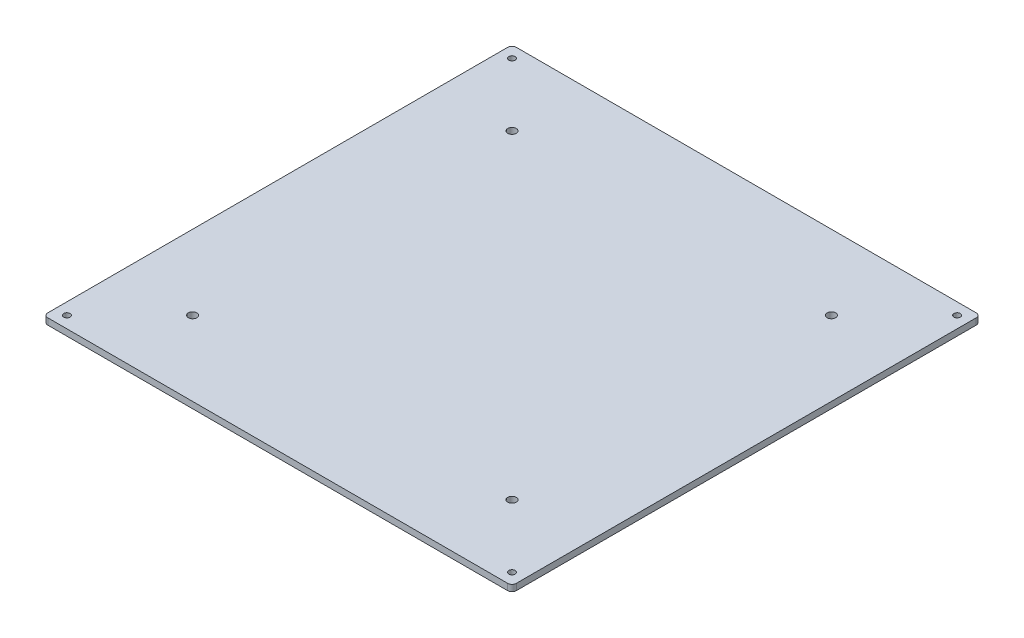
ISO-10303-21;
HEADER;
FILE_DESCRIPTION(('STEP AP214'),'2;1');
FILE_NAME('part.step','',(''),(''),'','','');
FILE_SCHEMA(('AUTOMOTIVE_DESIGN { 1 0 10303 214 1 1 1 1 }'));
ENDSEC;
DATA;
#1=APPLICATION_CONTEXT('core data for automotive mechanical design processes');
#2=APPLICATION_PROTOCOL_DEFINITION('international standard','automotive_design',2000,#1);
#3=PRODUCT_CONTEXT('',#1,'mechanical');
#4=PRODUCT('Part','Part','',(#3));
#5=PRODUCT_RELATED_PRODUCT_CATEGORY('part','',(#4));
#6=PRODUCT_DEFINITION_FORMATION('','',#4);
#7=PRODUCT_DEFINITION_CONTEXT('part definition',#1,'design');
#8=PRODUCT_DEFINITION('design','',#6,#7);
#9=PRODUCT_DEFINITION_SHAPE('','',#8);
#10=(LENGTH_UNIT() NAMED_UNIT(*) SI_UNIT(.MILLI.,.METRE.));
#11=(NAMED_UNIT(*) PLANE_ANGLE_UNIT() SI_UNIT($,.RADIAN.));
#12=(NAMED_UNIT(*) SI_UNIT($,.STERADIAN.) SOLID_ANGLE_UNIT());
#13=UNCERTAINTY_MEASURE_WITH_UNIT(LENGTH_MEASURE(1.E-05),#10,'distance_accuracy_value','');
#14=(GEOMETRIC_REPRESENTATION_CONTEXT(3) GLOBAL_UNCERTAINTY_ASSIGNED_CONTEXT((#13)) GLOBAL_UNIT_ASSIGNED_CONTEXT((#10,
#11,#12)) REPRESENTATION_CONTEXT('',''));
#15=CARTESIAN_POINT('',(0.,0.,0.));
#16=DIRECTION('',(0.,0.,1.));
#17=DIRECTION('',(1.,0.,0.));
#18=AXIS2_PLACEMENT_3D('',#15,#16,#17);
#19=CARTESIAN_POINT('',(-110.,3.,110.));
#20=DIRECTION('',(1.,0.,0.));
#21=DIRECTION('',(0.,0.,-1.));
#22=AXIS2_PLACEMENT_3D('',#19,#20,#21);
#23=PLANE('',#22);
#24=DIRECTION('',(0.,0.,1.));
#25=VECTOR('',#24,1.);
#26=CARTESIAN_POINT('',(-110.,3.,110.));
#27=LINE('',#26,#25);
#28=CARTESIAN_POINT('',(-110.,3.,-108.));
#29=VERTEX_POINT('',#28);
#30=CARTESIAN_POINT('',(-110.,3.,108.));
#31=VERTEX_POINT('',#30);
#32=EDGE_CURVE('E119',#29,#31,#27,.T.);
#33=ORIENTED_EDGE('',*,*,#32,.F.);
#34=DIRECTION('',(0.,-1.,0.));
#35=VECTOR('',#34,1.);
#36=CARTESIAN_POINT('',(-110.,3.,-108.));
#37=LINE('',#36,#35);
#38=CARTESIAN_POINT('',(-110.,0.,-108.));
#39=VERTEX_POINT('',#38);
#40=EDGE_CURVE('E104',#29,#39,#37,.T.);
#41=ORIENTED_EDGE('',*,*,#40,.T.);
#42=DIRECTION('',(0.,0.,1.));
#43=VECTOR('',#42,1.);
#44=CARTESIAN_POINT('',(-110.,0.,110.));
#45=LINE('',#44,#43);
#46=CARTESIAN_POINT('',(-110.,0.,108.));
#47=VERTEX_POINT('',#46);
#48=EDGE_CURVE('E116',#39,#47,#45,.T.);
#49=ORIENTED_EDGE('',*,*,#48,.T.);
#50=DIRECTION('',(0.,-1.,0.));
#51=VECTOR('',#50,1.);
#52=CARTESIAN_POINT('',(-110.,3.,108.));
#53=LINE('',#52,#51);
#54=EDGE_CURVE('E121',#47,#31,#53,.F.);
#55=ORIENTED_EDGE('',*,*,#54,.T.);
#56=EDGE_LOOP('',(#33,#41,#49,#55));
#57=FACE_BOUND('',#56,.T.);
#58=ADVANCED_FACE('F34',(#57),#23,.F.);
#59=CARTESIAN_POINT('',(110.,3.,110.));
#60=DIRECTION('',(0.,0.,-1.));
#61=DIRECTION('',(-1.,0.,0.));
#62=AXIS2_PLACEMENT_3D('',#59,#60,#61);
#63=PLANE('',#62);
#64=DIRECTION('',(1.,0.,0.));
#65=VECTOR('',#64,1.);
#66=CARTESIAN_POINT('',(110.,0.,110.));
#67=LINE('',#66,#65);
#68=CARTESIAN_POINT('',(-108.,0.,110.));
#69=VERTEX_POINT('',#68);
#70=CARTESIAN_POINT('',(108.,0.,110.));
#71=VERTEX_POINT('',#70);
#72=EDGE_CURVE('E125',#69,#71,#67,.T.);
#73=ORIENTED_EDGE('',*,*,#72,.T.);
#74=DIRECTION('',(0.,-1.,0.));
#75=VECTOR('',#74,1.);
#76=CARTESIAN_POINT('',(108.,3.,110.));
#77=LINE('',#76,#75);
#78=CARTESIAN_POINT('',(108.,3.,110.));
#79=VERTEX_POINT('',#78);
#80=EDGE_CURVE('E11',#71,#79,#77,.F.);
#81=ORIENTED_EDGE('',*,*,#80,.T.);
#82=DIRECTION('',(1.,0.,0.));
#83=VECTOR('',#82,1.);
#84=CARTESIAN_POINT('',(110.,3.,110.));
#85=LINE('',#84,#83);
#86=CARTESIAN_POINT('',(-108.,3.,110.));
#87=VERTEX_POINT('',#86);
#88=EDGE_CURVE('E186',#87,#79,#85,.T.);
#89=ORIENTED_EDGE('',*,*,#88,.F.);
#90=DIRECTION('',(0.,-1.,0.));
#91=VECTOR('',#90,1.);
#92=CARTESIAN_POINT('',(-108.,3.,110.));
#93=LINE('',#92,#91);
#94=EDGE_CURVE('E42',#87,#69,#93,.T.);
#95=ORIENTED_EDGE('',*,*,#94,.T.);
#96=EDGE_LOOP('',(#73,#81,#89,#95));
#97=FACE_BOUND('',#96,.T.);
#98=ADVANCED_FACE('F184',(#97),#63,.F.);
#99=CARTESIAN_POINT('',(110.,3.,110.));
#100=DIRECTION('',(-1.,0.,0.));
#101=DIRECTION('',(0.,0.,1.));
#102=AXIS2_PLACEMENT_3D('',#99,#100,#101);
#103=PLANE('',#102);
#104=DIRECTION('',(0.,0.,-1.));
#105=VECTOR('',#104,1.);
#106=CARTESIAN_POINT('',(110.,0.,110.));
#107=LINE('',#106,#105);
#108=CARTESIAN_POINT('',(110.,0.,108.));
#109=VERTEX_POINT('',#108);
#110=CARTESIAN_POINT('',(110.,0.,-108.));
#111=VERTEX_POINT('',#110);
#112=EDGE_CURVE('E129',#109,#111,#107,.T.);
#113=ORIENTED_EDGE('',*,*,#112,.T.);
#114=DIRECTION('',(0.,-1.,0.));
#115=VECTOR('',#114,1.);
#116=CARTESIAN_POINT('',(110.,3.,-108.));
#117=LINE('',#116,#115);
#118=CARTESIAN_POINT('',(110.,3.,-108.));
#119=VERTEX_POINT('',#118);
#120=EDGE_CURVE('E49',#111,#119,#117,.F.);
#121=ORIENTED_EDGE('',*,*,#120,.T.);
#122=DIRECTION('',(0.,0.,-1.));
#123=VECTOR('',#122,1.);
#124=CARTESIAN_POINT('',(110.,3.,110.));
#125=LINE('',#124,#123);
#126=CARTESIAN_POINT('',(110.,3.,108.));
#127=VERTEX_POINT('',#126);
#128=EDGE_CURVE('E194',#127,#119,#125,.T.);
#129=ORIENTED_EDGE('',*,*,#128,.F.);
#130=DIRECTION('',(0.,-1.,0.));
#131=VECTOR('',#130,1.);
#132=CARTESIAN_POINT('',(110.,3.,108.));
#133=LINE('',#132,#131);
#134=EDGE_CURVE('E177',#127,#109,#133,.T.);
#135=ORIENTED_EDGE('',*,*,#134,.T.);
#136=EDGE_LOOP('',(#113,#121,#129,#135));
#137=FACE_BOUND('',#136,.T.);
#138=ADVANCED_FACE('F193',(#137),#103,.F.);
#139=CARTESIAN_POINT('',(110.,3.,-110.));
#140=DIRECTION('',(0.,0.,1.));
#141=DIRECTION('',(1.,0.,0.));
#142=AXIS2_PLACEMENT_3D('',#139,#140,#141);
#143=PLANE('',#142);
#144=DIRECTION('',(-1.,0.,0.));
#145=VECTOR('',#144,1.);
#146=CARTESIAN_POINT('',(110.,0.,-110.));
#147=LINE('',#146,#145);
#148=CARTESIAN_POINT('',(108.,0.,-110.));
#149=VERTEX_POINT('',#148);
#150=CARTESIAN_POINT('',(-108.,0.,-110.));
#151=VERTEX_POINT('',#150);
#152=EDGE_CURVE('E139',#149,#151,#147,.T.);
#153=ORIENTED_EDGE('',*,*,#152,.T.);
#154=DIRECTION('',(0.,-1.,0.));
#155=VECTOR('',#154,1.);
#156=CARTESIAN_POINT('',(-108.,3.,-110.));
#157=LINE('',#156,#155);
#158=CARTESIAN_POINT('',(-108.,3.,-110.));
#159=VERTEX_POINT('',#158);
#160=EDGE_CURVE('E105',#151,#159,#157,.F.);
#161=ORIENTED_EDGE('',*,*,#160,.T.);
#162=DIRECTION('',(-1.,0.,0.));
#163=VECTOR('',#162,1.);
#164=CARTESIAN_POINT('',(110.,3.,-110.));
#165=LINE('',#164,#163);
#166=CARTESIAN_POINT('',(108.,3.,-110.));
#167=VERTEX_POINT('',#166);
#168=EDGE_CURVE('E135',#167,#159,#165,.T.);
#169=ORIENTED_EDGE('',*,*,#168,.F.);
#170=DIRECTION('',(0.,-1.,0.));
#171=VECTOR('',#170,1.);
#172=CARTESIAN_POINT('',(108.,3.,-110.));
#173=LINE('',#172,#171);
#174=EDGE_CURVE('E110',#167,#149,#173,.T.);
#175=ORIENTED_EDGE('',*,*,#174,.T.);
#176=EDGE_LOOP('',(#153,#161,#169,#175));
#177=FACE_BOUND('',#176,.T.);
#178=ADVANCED_FACE('F230',(#177),#143,.F.);
#179=CARTESIAN_POINT('',(0.,3.,0.));
#180=DIRECTION('',(0.,1.,0.));
#181=DIRECTION('',(0.,0.,1.));
#182=AXIS2_PLACEMENT_3D('',#179,#180,#181);
#183=PLANE('',#182);
#184=CARTESIAN_POINT('',(75.0000000000001,3.,-75.));
#185=DIRECTION('',(0.,1.,0.));
#186=DIRECTION('',(0.,0.,1.));
#187=AXIS2_PLACEMENT_3D('',#184,#185,#186);
#188=CIRCLE('',#187,2.);
#189=CARTESIAN_POINT('',(75.0000000000001,3.,-73.));
#190=VERTEX_POINT('',#189);
#191=EDGE_CURVE('E202',#190,#190,#188,.T.);
#192=ORIENTED_EDGE('',*,*,#191,.F.);
#193=EDGE_LOOP('',(#192));
#194=FACE_BOUND('',#193,.T.);
#195=CARTESIAN_POINT('',(75.0000000000001,3.,75.));
#196=DIRECTION('',(0.,1.,0.));
#197=DIRECTION('',(0.,0.,1.));
#198=AXIS2_PLACEMENT_3D('',#195,#196,#197);
#199=CIRCLE('',#198,2.);
#200=CARTESIAN_POINT('',(75.0000000000001,3.,77.));
#201=VERTEX_POINT('',#200);
#202=EDGE_CURVE('E210',#201,#201,#199,.T.);
#203=ORIENTED_EDGE('',*,*,#202,.F.);
#204=EDGE_LOOP('',(#203));
#205=FACE_BOUND('',#204,.T.);
#206=CARTESIAN_POINT('',(-75.0000000000001,3.,75.));
#207=DIRECTION('',(0.,1.,0.));
#208=DIRECTION('',(0.,0.,1.));
#209=AXIS2_PLACEMENT_3D('',#206,#207,#208);
#210=CIRCLE('',#209,2.);
#211=CARTESIAN_POINT('',(-75.0000000000001,3.,77.));
#212=VERTEX_POINT('',#211);
#213=EDGE_CURVE('E206',#212,#212,#210,.T.);
#214=ORIENTED_EDGE('',*,*,#213,.F.);
#215=EDGE_LOOP('',(#214));
#216=FACE_BOUND('',#215,.T.);
#217=CARTESIAN_POINT('',(-104.5,3.,-104.5));
#218=DIRECTION('',(0.,1.,0.));
#219=DIRECTION('',(0.,0.,1.));
#220=AXIS2_PLACEMENT_3D('',#217,#218,#219);
#221=CIRCLE('',#220,1.5);
#222=CARTESIAN_POINT('',(-104.5,3.,-103.));
#223=VERTEX_POINT('',#222);
#224=EDGE_CURVE('E203',#223,#223,#221,.T.);
#225=ORIENTED_EDGE('',*,*,#224,.F.);
#226=EDGE_LOOP('',(#225));
#227=FACE_BOUND('',#226,.T.);
#228=CARTESIAN_POINT('',(104.5,3.,-104.5));
#229=DIRECTION('',(0.,1.,0.));
#230=DIRECTION('',(0.,0.,1.));
#231=AXIS2_PLACEMENT_3D('',#228,#229,#230);
#232=CIRCLE('',#231,1.5);
#233=CARTESIAN_POINT('',(104.5,3.,-103.));
#234=VERTEX_POINT('',#233);
#235=EDGE_CURVE('E207',#234,#234,#232,.T.);
#236=ORIENTED_EDGE('',*,*,#235,.F.);
#237=EDGE_LOOP('',(#236));
#238=FACE_BOUND('',#237,.T.);
#239=CARTESIAN_POINT('',(104.5,3.,104.5));
#240=DIRECTION('',(0.,1.,0.));
#241=DIRECTION('',(0.,0.,1.));
#242=AXIS2_PLACEMENT_3D('',#239,#240,#241);
#243=CIRCLE('',#242,1.5);
#244=CARTESIAN_POINT('',(104.5,3.,106.));
#245=VERTEX_POINT('',#244);
#246=EDGE_CURVE('E218',#245,#245,#243,.T.);
#247=ORIENTED_EDGE('',*,*,#246,.F.);
#248=EDGE_LOOP('',(#247));
#249=FACE_BOUND('',#248,.T.);
#250=CARTESIAN_POINT('',(-104.5,3.,104.5));
#251=DIRECTION('',(0.,1.,0.));
#252=DIRECTION('',(0.,0.,1.));
#253=AXIS2_PLACEMENT_3D('',#250,#251,#252);
#254=CIRCLE('',#253,1.5);
#255=CARTESIAN_POINT('',(-104.5,3.,106.));
#256=VERTEX_POINT('',#255);
#257=EDGE_CURVE('E215',#256,#256,#254,.T.);
#258=ORIENTED_EDGE('',*,*,#257,.F.);
#259=EDGE_LOOP('',(#258));
#260=FACE_BOUND('',#259,.T.);
#261=CARTESIAN_POINT('',(-75.0000000000001,3.,-75.));
#262=DIRECTION('',(0.,1.,0.));
#263=DIRECTION('',(0.,0.,1.));
#264=AXIS2_PLACEMENT_3D('',#261,#262,#263);
#265=CIRCLE('',#264,2.);
#266=CARTESIAN_POINT('',(-75.0000000000001,3.,-73.));
#267=VERTEX_POINT('',#266);
#268=EDGE_CURVE('E145',#267,#267,#265,.T.);
#269=ORIENTED_EDGE('',*,*,#268,.F.);
#270=EDGE_LOOP('',(#269));
#271=FACE_BOUND('',#270,.T.);
#272=ORIENTED_EDGE('',*,*,#168,.T.);
#273=CARTESIAN_POINT('',(-108.,3.,-108.));
#274=DIRECTION('',(0.,1.,0.));
#275=DIRECTION('',(0.,0.,1.));
#276=AXIS2_PLACEMENT_3D('',#273,#274,#275);
#277=CIRCLE('',#276,2.);
#278=EDGE_CURVE('E175',#159,#29,#277,.T.);
#279=ORIENTED_EDGE('',*,*,#278,.T.);
#280=ORIENTED_EDGE('',*,*,#32,.T.);
#281=CARTESIAN_POINT('',(-108.,3.,108.));
#282=DIRECTION('',(0.,1.,0.));
#283=DIRECTION('',(0.,0.,1.));
#284=AXIS2_PLACEMENT_3D('',#281,#282,#283);
#285=CIRCLE('',#284,2.);
#286=EDGE_CURVE('E170',#31,#87,#285,.T.);
#287=ORIENTED_EDGE('',*,*,#286,.T.);
#288=ORIENTED_EDGE('',*,*,#88,.T.);
#289=CARTESIAN_POINT('',(108.,3.,108.));
#290=DIRECTION('',(0.,1.,0.));
#291=DIRECTION('',(0.,0.,1.));
#292=AXIS2_PLACEMENT_3D('',#289,#290,#291);
#293=CIRCLE('',#292,2.);
#294=EDGE_CURVE('E56',#79,#127,#293,.T.);
#295=ORIENTED_EDGE('',*,*,#294,.T.);
#296=ORIENTED_EDGE('',*,*,#128,.T.);
#297=CARTESIAN_POINT('',(108.,3.,-108.));
#298=DIRECTION('',(0.,1.,0.));
#299=DIRECTION('',(0.,0.,1.));
#300=AXIS2_PLACEMENT_3D('',#297,#298,#299);
#301=CIRCLE('',#300,2.);
#302=EDGE_CURVE('E173',#119,#167,#301,.T.);
#303=ORIENTED_EDGE('',*,*,#302,.T.);
#304=EDGE_LOOP('',(#272,#279,#280,#287,#288,#295,#296,#303));
#305=FACE_BOUND('',#304,.T.);
#306=ADVANCED_FACE('F227',(#194,#205,#216,#227,#238,#249,#260,#271,#305),#183,.T.);
#307=CARTESIAN_POINT('',(0.,0.,0.));
#308=DIRECTION('',(0.,1.,0.));
#309=DIRECTION('',(0.,0.,1.));
#310=AXIS2_PLACEMENT_3D('',#307,#308,#309);
#311=PLANE('',#310);
#312=CARTESIAN_POINT('',(75.0000000000001,0.,-75.));
#313=DIRECTION('',(0.,1.,0.));
#314=DIRECTION('',(0.,0.,1.));
#315=AXIS2_PLACEMENT_3D('',#312,#313,#314);
#316=CIRCLE('',#315,2.);
#317=CARTESIAN_POINT('',(75.0000000000001,0.,-73.));
#318=VERTEX_POINT('',#317);
#319=EDGE_CURVE('E126',#318,#318,#316,.T.);
#320=ORIENTED_EDGE('',*,*,#319,.T.);
#321=EDGE_LOOP('',(#320));
#322=FACE_BOUND('',#321,.T.);
#323=CARTESIAN_POINT('',(75.0000000000001,0.,75.));
#324=DIRECTION('',(0.,1.,0.));
#325=DIRECTION('',(0.,0.,1.));
#326=AXIS2_PLACEMENT_3D('',#323,#324,#325);
#327=CIRCLE('',#326,2.);
#328=CARTESIAN_POINT('',(75.0000000000001,0.,77.));
#329=VERTEX_POINT('',#328);
#330=EDGE_CURVE('E132',#329,#329,#327,.T.);
#331=ORIENTED_EDGE('',*,*,#330,.T.);
#332=EDGE_LOOP('',(#331));
#333=FACE_BOUND('',#332,.T.);
#334=CARTESIAN_POINT('',(-75.0000000000001,0.,75.));
#335=DIRECTION('',(0.,1.,0.));
#336=DIRECTION('',(0.,0.,1.));
#337=AXIS2_PLACEMENT_3D('',#334,#335,#336);
#338=CIRCLE('',#337,2.);
#339=CARTESIAN_POINT('',(-75.0000000000001,0.,77.));
#340=VERTEX_POINT('',#339);
#341=EDGE_CURVE('E157',#340,#340,#338,.T.);
#342=ORIENTED_EDGE('',*,*,#341,.T.);
#343=EDGE_LOOP('',(#342));
#344=FACE_BOUND('',#343,.T.);
#345=CARTESIAN_POINT('',(-104.5,0.,-104.5));
#346=DIRECTION('',(0.,1.,0.));
#347=DIRECTION('',(0.,0.,1.));
#348=AXIS2_PLACEMENT_3D('',#345,#346,#347);
#349=CIRCLE('',#348,1.5);
#350=CARTESIAN_POINT('',(-104.5,0.,-103.));
#351=VERTEX_POINT('',#350);
#352=EDGE_CURVE('E154',#351,#351,#349,.T.);
#353=ORIENTED_EDGE('',*,*,#352,.T.);
#354=EDGE_LOOP('',(#353));
#355=FACE_BOUND('',#354,.T.);
#356=CARTESIAN_POINT('',(104.5,0.,-104.5));
#357=DIRECTION('',(0.,1.,0.));
#358=DIRECTION('',(0.,0.,1.));
#359=AXIS2_PLACEMENT_3D('',#356,#357,#358);
#360=CIRCLE('',#359,1.5);
#361=CARTESIAN_POINT('',(104.5,0.,-103.));
#362=VERTEX_POINT('',#361);
#363=EDGE_CURVE('E151',#362,#362,#360,.T.);
#364=ORIENTED_EDGE('',*,*,#363,.T.);
#365=EDGE_LOOP('',(#364));
#366=FACE_BOUND('',#365,.T.);
#367=CARTESIAN_POINT('',(104.5,0.,104.5));
#368=DIRECTION('',(0.,1.,0.));
#369=DIRECTION('',(0.,0.,1.));
#370=AXIS2_PLACEMENT_3D('',#367,#368,#369);
#371=CIRCLE('',#370,1.5);
#372=CARTESIAN_POINT('',(104.5,0.,106.));
#373=VERTEX_POINT('',#372);
#374=EDGE_CURVE('E148',#373,#373,#371,.T.);
#375=ORIENTED_EDGE('',*,*,#374,.T.);
#376=EDGE_LOOP('',(#375));
#377=FACE_BOUND('',#376,.T.);
#378=CARTESIAN_POINT('',(-104.5,0.,104.5));
#379=DIRECTION('',(0.,1.,0.));
#380=DIRECTION('',(0.,0.,1.));
#381=AXIS2_PLACEMENT_3D('',#378,#379,#380);
#382=CIRCLE('',#381,1.5);
#383=CARTESIAN_POINT('',(-104.5,0.,106.));
#384=VERTEX_POINT('',#383);
#385=EDGE_CURVE('E144',#384,#384,#382,.T.);
#386=ORIENTED_EDGE('',*,*,#385,.T.);
#387=EDGE_LOOP('',(#386));
#388=FACE_BOUND('',#387,.T.);
#389=CARTESIAN_POINT('',(-75.0000000000001,0.,-75.));
#390=DIRECTION('',(0.,1.,0.));
#391=DIRECTION('',(0.,0.,1.));
#392=AXIS2_PLACEMENT_3D('',#389,#390,#391);
#393=CIRCLE('',#392,2.);
#394=CARTESIAN_POINT('',(-75.0000000000001,0.,-73.));
#395=VERTEX_POINT('',#394);
#396=EDGE_CURVE('E141',#395,#395,#393,.T.);
#397=ORIENTED_EDGE('',*,*,#396,.T.);
#398=EDGE_LOOP('',(#397));
#399=FACE_BOUND('',#398,.T.);
#400=ORIENTED_EDGE('',*,*,#48,.F.);
#401=CARTESIAN_POINT('',(-108.,0.,-108.));
#402=DIRECTION('',(0.,1.,0.));
#403=DIRECTION('',(0.,0.,1.));
#404=AXIS2_PLACEMENT_3D('',#401,#402,#403);
#405=CIRCLE('',#404,2.);
#406=EDGE_CURVE('E100',#39,#151,#405,.F.);
#407=ORIENTED_EDGE('',*,*,#406,.T.);
#408=ORIENTED_EDGE('',*,*,#152,.F.);
#409=CARTESIAN_POINT('',(108.,0.,-108.));
#410=DIRECTION('',(0.,1.,0.));
#411=DIRECTION('',(0.,0.,1.));
#412=AXIS2_PLACEMENT_3D('',#409,#410,#411);
#413=CIRCLE('',#412,2.);
#414=EDGE_CURVE('E111',#149,#111,#413,.F.);
#415=ORIENTED_EDGE('',*,*,#414,.T.);
#416=ORIENTED_EDGE('',*,*,#112,.F.);
#417=CARTESIAN_POINT('',(108.,0.,108.));
#418=DIRECTION('',(0.,1.,0.));
#419=DIRECTION('',(0.,0.,1.));
#420=AXIS2_PLACEMENT_3D('',#417,#418,#419);
#421=CIRCLE('',#420,2.);
#422=EDGE_CURVE('E164',#109,#71,#421,.F.);
#423=ORIENTED_EDGE('',*,*,#422,.T.);
#424=ORIENTED_EDGE('',*,*,#72,.F.);
#425=CARTESIAN_POINT('',(-108.,0.,108.));
#426=DIRECTION('',(0.,1.,0.));
#427=DIRECTION('',(0.,0.,1.));
#428=AXIS2_PLACEMENT_3D('',#425,#426,#427);
#429=CIRCLE('',#428,2.);
#430=EDGE_CURVE('E120',#69,#47,#429,.F.);
#431=ORIENTED_EDGE('',*,*,#430,.T.);
#432=EDGE_LOOP('',(#400,#407,#408,#415,#416,#423,#424,#431));
#433=FACE_BOUND('',#432,.T.);
#434=ADVANCED_FACE('F123',(#322,#333,#344,#355,#366,#377,#388,#399,#433),#311,.F.);
#435=CARTESIAN_POINT('',(-75.0000000000001,-7.,-75.));
#436=DIRECTION('',(0.,1.,0.));
#437=DIRECTION('',(0.,0.,1.));
#438=AXIS2_PLACEMENT_3D('',#435,#436,#437);
#439=CYLINDRICAL_SURFACE('',#438,2.);
#440=ORIENTED_EDGE('',*,*,#268,.T.);
#441=EDGE_LOOP('',(#440));
#442=FACE_BOUND('',#441,.T.);
#443=ORIENTED_EDGE('',*,*,#396,.F.);
#444=EDGE_LOOP('',(#443));
#445=FACE_BOUND('',#444,.T.);
#446=ADVANCED_FACE('F263',(#442,#445),#439,.F.);
#447=CARTESIAN_POINT('',(-104.5,-7.,104.5));
#448=DIRECTION('',(0.,1.,0.));
#449=DIRECTION('',(0.,0.,1.));
#450=AXIS2_PLACEMENT_3D('',#447,#448,#449);
#451=CYLINDRICAL_SURFACE('',#450,1.5);
#452=ORIENTED_EDGE('',*,*,#257,.T.);
#453=EDGE_LOOP('',(#452));
#454=FACE_BOUND('',#453,.T.);
#455=ORIENTED_EDGE('',*,*,#385,.F.);
#456=EDGE_LOOP('',(#455));
#457=FACE_BOUND('',#456,.T.);
#458=ADVANCED_FACE('F268',(#454,#457),#451,.F.);
#459=CARTESIAN_POINT('',(104.5,-7.,104.5));
#460=DIRECTION('',(0.,1.,0.));
#461=DIRECTION('',(0.,0.,1.));
#462=AXIS2_PLACEMENT_3D('',#459,#460,#461);
#463=CYLINDRICAL_SURFACE('',#462,1.5);
#464=ORIENTED_EDGE('',*,*,#246,.T.);
#465=EDGE_LOOP('',(#464));
#466=FACE_BOUND('',#465,.T.);
#467=ORIENTED_EDGE('',*,*,#374,.F.);
#468=EDGE_LOOP('',(#467));
#469=FACE_BOUND('',#468,.T.);
#470=ADVANCED_FACE('F287',(#466,#469),#463,.F.);
#471=CARTESIAN_POINT('',(104.5,-7.,-104.5));
#472=DIRECTION('',(0.,1.,0.));
#473=DIRECTION('',(0.,0.,1.));
#474=AXIS2_PLACEMENT_3D('',#471,#472,#473);
#475=CYLINDRICAL_SURFACE('',#474,1.5);
#476=ORIENTED_EDGE('',*,*,#235,.T.);
#477=EDGE_LOOP('',(#476));
#478=FACE_BOUND('',#477,.T.);
#479=ORIENTED_EDGE('',*,*,#363,.F.);
#480=EDGE_LOOP('',(#479));
#481=FACE_BOUND('',#480,.T.);
#482=ADVANCED_FACE('F224',(#478,#481),#475,.F.);
#483=CARTESIAN_POINT('',(-104.5,-7.,-104.5));
#484=DIRECTION('',(0.,1.,0.));
#485=DIRECTION('',(0.,0.,1.));
#486=AXIS2_PLACEMENT_3D('',#483,#484,#485);
#487=CYLINDRICAL_SURFACE('',#486,1.5);
#488=ORIENTED_EDGE('',*,*,#224,.T.);
#489=EDGE_LOOP('',(#488));
#490=FACE_BOUND('',#489,.T.);
#491=ORIENTED_EDGE('',*,*,#352,.F.);
#492=EDGE_LOOP('',(#491));
#493=FACE_BOUND('',#492,.T.);
#494=ADVANCED_FACE('F270',(#490,#493),#487,.F.);
#495=CARTESIAN_POINT('',(-75.0000000000001,-7.,75.));
#496=DIRECTION('',(0.,1.,0.));
#497=DIRECTION('',(0.,0.,1.));
#498=AXIS2_PLACEMENT_3D('',#495,#496,#497);
#499=CYLINDRICAL_SURFACE('',#498,2.);
#500=ORIENTED_EDGE('',*,*,#213,.T.);
#501=EDGE_LOOP('',(#500));
#502=FACE_BOUND('',#501,.T.);
#503=ORIENTED_EDGE('',*,*,#341,.F.);
#504=EDGE_LOOP('',(#503));
#505=FACE_BOUND('',#504,.T.);
#506=ADVANCED_FACE('F273',(#502,#505),#499,.F.);
#507=CARTESIAN_POINT('',(75.0000000000001,-7.,75.));
#508=DIRECTION('',(0.,1.,0.));
#509=DIRECTION('',(0.,0.,1.));
#510=AXIS2_PLACEMENT_3D('',#507,#508,#509);
#511=CYLINDRICAL_SURFACE('',#510,2.);
#512=ORIENTED_EDGE('',*,*,#202,.T.);
#513=EDGE_LOOP('',(#512));
#514=FACE_BOUND('',#513,.T.);
#515=ORIENTED_EDGE('',*,*,#330,.F.);
#516=EDGE_LOOP('',(#515));
#517=FACE_BOUND('',#516,.T.);
#518=ADVANCED_FACE('F277',(#514,#517),#511,.F.);
#519=CARTESIAN_POINT('',(75.0000000000001,-7.,-75.));
#520=DIRECTION('',(0.,1.,0.));
#521=DIRECTION('',(0.,0.,1.));
#522=AXIS2_PLACEMENT_3D('',#519,#520,#521);
#523=CYLINDRICAL_SURFACE('',#522,2.);
#524=ORIENTED_EDGE('',*,*,#191,.T.);
#525=EDGE_LOOP('',(#524));
#526=FACE_BOUND('',#525,.T.);
#527=ORIENTED_EDGE('',*,*,#319,.F.);
#528=EDGE_LOOP('',(#527));
#529=FACE_BOUND('',#528,.T.);
#530=ADVANCED_FACE('F249',(#526,#529),#523,.F.);
#531=CARTESIAN_POINT('',(-108.,3.,-108.));
#532=DIRECTION('',(0.,-1.,0.));
#533=DIRECTION('',(0.,0.,-1.));
#534=AXIS2_PLACEMENT_3D('',#531,#532,#533);
#535=CYLINDRICAL_SURFACE('',#534,2.);
#536=ORIENTED_EDGE('',*,*,#278,.F.);
#537=ORIENTED_EDGE('',*,*,#160,.F.);
#538=ORIENTED_EDGE('',*,*,#406,.F.);
#539=ORIENTED_EDGE('',*,*,#40,.F.);
#540=EDGE_LOOP('',(#536,#537,#538,#539));
#541=FACE_BOUND('',#540,.T.);
#542=ADVANCED_FACE('F103',(#541),#535,.T.);
#543=CARTESIAN_POINT('',(108.,3.,-108.));
#544=DIRECTION('',(0.,-1.,0.));
#545=DIRECTION('',(0.,0.,-1.));
#546=AXIS2_PLACEMENT_3D('',#543,#544,#545);
#547=CYLINDRICAL_SURFACE('',#546,2.);
#548=ORIENTED_EDGE('',*,*,#302,.F.);
#549=ORIENTED_EDGE('',*,*,#120,.F.);
#550=ORIENTED_EDGE('',*,*,#414,.F.);
#551=ORIENTED_EDGE('',*,*,#174,.F.);
#552=EDGE_LOOP('',(#548,#549,#550,#551));
#553=FACE_BOUND('',#552,.T.);
#554=ADVANCED_FACE('F242',(#553),#547,.T.);
#555=CARTESIAN_POINT('',(108.,3.,108.));
#556=DIRECTION('',(0.,-1.,0.));
#557=DIRECTION('',(0.,0.,-1.));
#558=AXIS2_PLACEMENT_3D('',#555,#556,#557);
#559=CYLINDRICAL_SURFACE('',#558,2.);
#560=ORIENTED_EDGE('',*,*,#294,.F.);
#561=ORIENTED_EDGE('',*,*,#80,.F.);
#562=ORIENTED_EDGE('',*,*,#422,.F.);
#563=ORIENTED_EDGE('',*,*,#134,.F.);
#564=EDGE_LOOP('',(#560,#561,#562,#563));
#565=FACE_BOUND('',#564,.T.);
#566=ADVANCED_FACE('F192',(#565),#559,.T.);
#567=CARTESIAN_POINT('',(-108.,3.,108.));
#568=DIRECTION('',(0.,-1.,0.));
#569=DIRECTION('',(0.,0.,-1.));
#570=AXIS2_PLACEMENT_3D('',#567,#568,#569);
#571=CYLINDRICAL_SURFACE('',#570,2.);
#572=ORIENTED_EDGE('',*,*,#286,.F.);
#573=ORIENTED_EDGE('',*,*,#54,.F.);
#574=ORIENTED_EDGE('',*,*,#430,.F.);
#575=ORIENTED_EDGE('',*,*,#94,.F.);
#576=EDGE_LOOP('',(#572,#573,#574,#575));
#577=FACE_BOUND('',#576,.T.);
#578=ADVANCED_FACE('F36',(#577),#571,.T.);
#579=CLOSED_SHELL('',(#58,#98,#138,#178,#306,#434,#446,#458,#470,#482,#494,#506,#518,#530,#542,
#554,#566,#578));
#580=MANIFOLD_SOLID_BREP('B2',#579);
#581=ADVANCED_BREP_SHAPE_REPRESENTATION('',(#18,#580),#14);
#582=SHAPE_DEFINITION_REPRESENTATION(#9,#581);
ENDSEC;
END-ISO-10303-21;
